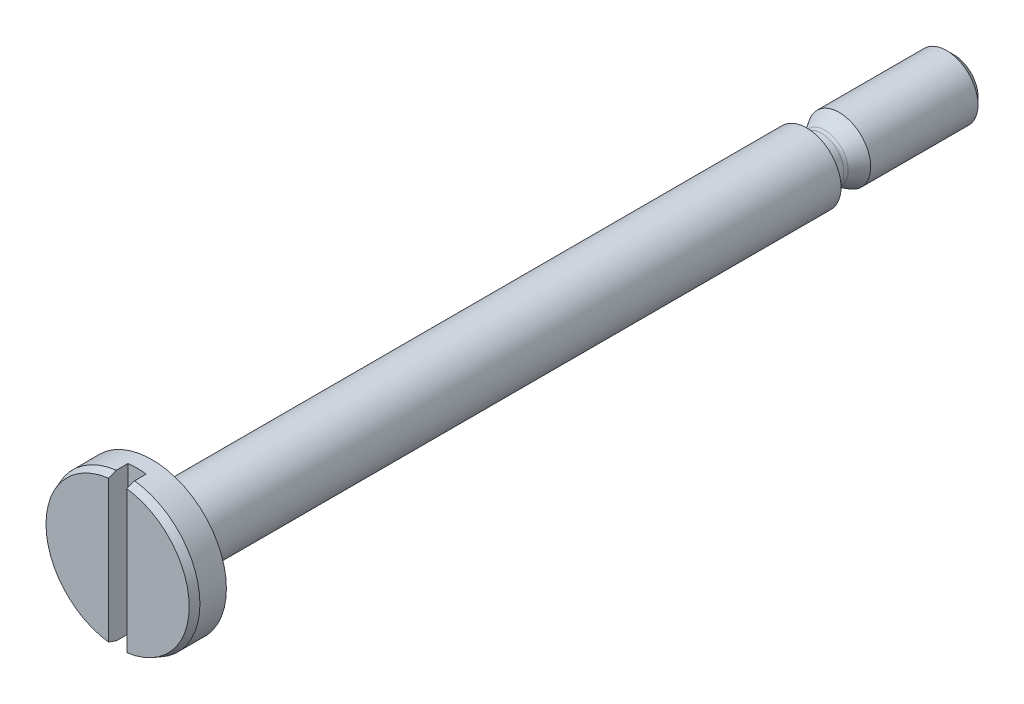
ISO-10303-21;
HEADER;
FILE_DESCRIPTION(('STEP AP214'),'2;1');
FILE_NAME('part.step','',(''),(''),'','','');
FILE_SCHEMA(('AUTOMOTIVE_DESIGN { 1 0 10303 214 1 1 1 1 }'));
ENDSEC;
DATA;
#1=APPLICATION_CONTEXT('core data for automotive mechanical design processes');
#2=APPLICATION_PROTOCOL_DEFINITION('international standard','automotive_design',2000,#1);
#3=PRODUCT_CONTEXT('',#1,'mechanical');
#4=PRODUCT('Part','Part','',(#3));
#5=PRODUCT_RELATED_PRODUCT_CATEGORY('part','',(#4));
#6=PRODUCT_DEFINITION_FORMATION('','',#4);
#7=PRODUCT_DEFINITION_CONTEXT('part definition',#1,'design');
#8=PRODUCT_DEFINITION('design','',#6,#7);
#9=PRODUCT_DEFINITION_SHAPE('','',#8);
#10=(LENGTH_UNIT() NAMED_UNIT(*) SI_UNIT(.MILLI.,.METRE.));
#11=(NAMED_UNIT(*) PLANE_ANGLE_UNIT() SI_UNIT($,.RADIAN.));
#12=(NAMED_UNIT(*) SI_UNIT($,.STERADIAN.) SOLID_ANGLE_UNIT());
#13=UNCERTAINTY_MEASURE_WITH_UNIT(LENGTH_MEASURE(1.E-05),#10,'distance_accuracy_value','');
#14=(GEOMETRIC_REPRESENTATION_CONTEXT(3) GLOBAL_UNCERTAINTY_ASSIGNED_CONTEXT((#13)) GLOBAL_UNIT_ASSIGNED_CONTEXT((#10,
#11,#12)) REPRESENTATION_CONTEXT('',''));
#15=CARTESIAN_POINT('',(0.,0.,0.));
#16=DIRECTION('',(0.,0.,1.));
#17=DIRECTION('',(1.,0.,0.));
#18=AXIS2_PLACEMENT_3D('',#15,#16,#17);
#19=CARTESIAN_POINT('',(0.,0.,3.));
#20=DIRECTION('',(0.,0.,-1.));
#21=DIRECTION('',(1.,0.,0.));
#22=AXIS2_PLACEMENT_3D('',#19,#20,#21);
#23=CONICAL_SURFACE('',#22,6.25,0.349065850398867);
#24=CARTESIAN_POINT('',(0.8,1.282684674784,16.0183331038921));
#25=CARTESIAN_POINT('',(0.8,1.31969750613252,15.9320289441217));
#26=CARTESIAN_POINT('',(0.8,1.35634529756199,15.8455695315623));
#27=CARTESIAN_POINT('',(0.8,1.42903656491699,15.6723985232406));
#28=CARTESIAN_POINT('',(0.8,1.46508005069706,15.5856869316177));
#29=CARTESIAN_POINT('',(0.8,1.57249053020005,15.3252667134921));
#30=CARTESIAN_POINT('',(0.8,1.64314160263818,15.1512631073264));
#31=CARTESIAN_POINT('',(0.8,1.78313581450831,14.8027514850206));
#32=CARTESIAN_POINT('',(0.8,1.85247907608069,14.6282435177574));
#33=CARTESIAN_POINT('',(0.8,1.99022713506688,14.2788544918747));
#34=CARTESIAN_POINT('',(0.8,2.05863191599028,14.1039734267616));
#35=CARTESIAN_POINT('',(0.8,2.26278116137589,13.5790140925357));
#36=CARTESIAN_POINT('',(0.8,2.39749418301222,13.228535117572));
#37=CARTESIAN_POINT('',(0.8,2.66528662696751,12.5269530735152));
#38=CARTESIAN_POINT('',(0.8,2.79836603791585,12.1758500000977));
#39=CARTESIAN_POINT('',(0.8,3.06345205775251,11.4732360697622));
#40=CARTESIAN_POINT('',(0.8,3.19545865793688,11.1217252095622));
#41=CARTESIAN_POINT('',(0.8,3.4587315757989,10.4184262531903));
#42=CARTESIAN_POINT('',(0.8,3.58999789273957,10.0666381567428));
#43=CARTESIAN_POINT('',(0.8,3.98306789976139,9.01083508666003));
#44=CARTESIAN_POINT('',(0.8,4.24408743945695,8.30652828340093));
#45=CARTESIAN_POINT('',(0.8,4.76494842099102,6.89748697210311));
#46=CARTESIAN_POINT('',(0.799999999999999,5.02478987328036,6.19275246792166));
#47=CARTESIAN_POINT('',(0.799999999999999,5.7807909534874,4.13910468669897));
#48=CARTESIAN_POINT('',(0.799999999999999,6.2759886502375,2.78983739057231));
#49=CARTESIAN_POINT('',(0.799999999999999,7.26515091776125,0.0908452356965721));
#50=CARTESIAN_POINT('',(0.799999999999999,7.75911548351327,-1.25887962489049));
#51=CARTESIAN_POINT('',(0.799999999999999,8.74610740807182,-3.95795180399829));
#52=CARTESIAN_POINT('',(0.799999999999999,9.23913509855763,-5.30729900122664));
#53=CARTESIAN_POINT('',(0.799999999999999,10.2247342626746,-8.00615262312761));
#54=CARTESIAN_POINT('',(0.799999999999999,10.7173057385002,-9.35565904699876));
#55=CARTESIAN_POINT('',(0.799999999999999,11.2097754923634,-10.7052024587557));
#56=B_SPLINE_CURVE_WITH_KNOTS('',3,(#24,#25,#26,#27,#28,#29,#30,#31,#32,#33,#34,#35,#36,#37,#38,
#39,#40,#41,#42,#43,#44,#45,#46,#47,#48,#49,#50,#51,#52,#53,#54,#55),.UNSPECIFIED.,.F.,.F.,(4,2,
2,2,2,2,2,2,2,2,2,2,2,2,2,4),(0.,0.281715728622603,0.563426858769586,1.12681803114341,
1.69015632353027,2.25350450189764,3.37992781530171,4.50635896464916,5.63279924387066,
6.75924064429566,9.01259437977368,11.2659280864542,15.5777341615755,19.8895577668937,
24.1993519975173,28.5091253889288),.UNSPECIFIED.);
#57=CARTESIAN_POINT('',(0.799999999999999,6.19858854901662,3.));
#58=VERTEX_POINT('',#57);
#59=CARTESIAN_POINT('',(0.799999999999999,6.45058136914805,2.31313064513635));
#60=VERTEX_POINT('',#59);
#61=EDGE_CURVE('E87',#58,#60,#56,.T.);
#62=ORIENTED_EDGE('',*,*,#61,.F.);
#63=CARTESIAN_POINT('',(0.,0.,3.));
#64=DIRECTION('',(0.,0.,1.));
#65=DIRECTION('',(1.,0.,0.));
#66=AXIS2_PLACEMENT_3D('',#63,#64,#65);
#67=CIRCLE('',#66,6.25);
#68=CARTESIAN_POINT('',(0.800000000000001,-6.19858854901662,3.));
#69=VERTEX_POINT('',#68);
#70=EDGE_CURVE('E136',#69,#58,#67,.T.);
#71=ORIENTED_EDGE('',*,*,#70,.F.);
#72=CARTESIAN_POINT('',(0.800000000000002,-11.2097754923634,-10.7052024587557));
#73=CARTESIAN_POINT('',(0.800000000000002,-10.7313151301791,-9.39404162645047));
#74=CARTESIAN_POINT('',(0.800000000000001,-10.252755273437,-8.08291699403422));
#75=CARTESIAN_POINT('',(0.800000000000001,-9.29521893896152,-5.46083732934418));
#76=CARTESIAN_POINT('',(0.800000000000001,-8.81624246618507,-4.14988229526002));
#77=CARTESIAN_POINT('',(0.800000000000001,-7.85766469950584,-1.52826472851652));
#78=CARTESIAN_POINT('',(0.800000000000001,-7.37806343341921,-0.217602185686537));
#79=CARTESIAN_POINT('',(0.800000000000001,-6.41774553158839,2.40333190126578));
#80=CARTESIAN_POINT('',(0.800000000000001,-5.93702888297808,3.71360344067908));
#81=CARTESIAN_POINT('',(0.800000000000001,-5.28600132063409,5.48332878199399));
#82=CARTESIAN_POINT('',(0.800000000000001,-5.11668814611759,5.94314953330291));
#83=CARTESIAN_POINT('',(0.800000000000001,-4.777673015673,6.86264619155293));
#84=CARTESIAN_POINT('',(0.800000000000001,-4.60797106088742,7.32232209891517));
#85=CARTESIAN_POINT('',(0.800000000000001,-4.26803947406773,8.24146371240554));
#86=CARTESIAN_POINT('',(0.800000000000001,-4.0978098574796,8.70092942424311));
#87=CARTESIAN_POINT('',(0.800000000000001,-3.75658153848174,9.61958053352974));
#88=CARTESIAN_POINT('',(0.800000000000001,-3.58558282833367,10.0787659281053));
#89=CARTESIAN_POINT('',(0.800000000000001,-3.24241966946291,10.9967505844536));
#90=CARTESIAN_POINT('',(0.8,-3.07025511341118,11.4555498061805));
#91=CARTESIAN_POINT('',(0.8,-2.81059604070906,12.1432074796072));
#92=CARTESIAN_POINT('',(0.8,-2.72380899629497,12.3723329720582));
#93=CARTESIAN_POINT('',(0.8,-2.54960336534001,12.8303458563595));
#94=CARTESIAN_POINT('',(0.8,-2.46218477430686,13.0592332465029));
#95=CARTESIAN_POINT('',(0.8,-2.28648055451115,13.5167070062225));
#96=CARTESIAN_POINT('',(0.8,-2.19819482216115,13.7452933360427));
#97=CARTESIAN_POINT('',(0.8,-2.02041957527863,14.2019936853438));
#98=CARTESIAN_POINT('',(0.8,-1.93093008433561,14.4301077139793));
#99=CARTESIAN_POINT('',(0.8,-1.7953388590614,14.7717553953045));
#100=CARTESIAN_POINT('',(0.8,-1.74991301108768,14.8855571516217));
#101=CARTESIAN_POINT('',(0.8,-1.65849116367512,15.1129305739045));
#102=CARTESIAN_POINT('',(0.8,-1.61249516862468,15.2265022416333));
#103=CARTESIAN_POINT('',(0.8,-1.51978061786124,15.4533599132112));
#104=CARTESIAN_POINT('',(0.8,-1.47306201431589,15.5666458975674));
#105=CARTESIAN_POINT('',(0.8,-1.37865883724757,15.7928177882445));
#106=CARTESIAN_POINT('',(0.8,-1.33097423809628,15.9057036838571));
#107=CARTESIAN_POINT('',(0.8,-1.28268467478399,16.0183331038921));
#108=B_SPLINE_CURVE_WITH_KNOTS('',3,(#72,#73,#74,#75,#76,#77,#78,#79,#80,#81,#82,#83,#84,#85,
#86,#87,#88,#89,#90,#91,#92,#93,#94,#95,#96,#97,#98,#99,#100,#101,#102,#103,#104,#105,#106,
#107),.UNSPECIFIED.,.F.,.F.,(4,2,2,2,2,2,2,2,2,2,2,2,2,2,2,2,2,4),(0.,4.18719533725143,
8.37434151750848,12.5613072531194,16.7483215286525,18.2183277493474,19.6883296556524,
21.1582889302119,22.6282630281829,24.0983743449473,24.8334072717516,25.5684454321062,
26.3035724936403,27.0386851701487,27.4062830998455,27.7738782019112,28.1414977415988,
28.5091270472139),.UNSPECIFIED.);
#109=CARTESIAN_POINT('',(0.800000000000001,-6.45058136914805,2.31313064513635));
#110=VERTEX_POINT('',#109);
#111=EDGE_CURVE('E169',#110,#69,#108,.T.);
#112=ORIENTED_EDGE('',*,*,#111,.F.);
#113=CARTESIAN_POINT('',(0.,0.,2.31313064513635));
#114=DIRECTION('',(0.,0.,-1.));
#115=DIRECTION('',(-1.,0.,0.));
#116=AXIS2_PLACEMENT_3D('',#113,#114,#115);
#117=CIRCLE('',#116,6.5);
#118=EDGE_CURVE('E139',#110,#60,#117,.F.);
#119=ORIENTED_EDGE('',*,*,#118,.T.);
#120=EDGE_LOOP('',(#62,#71,#112,#119));
#121=FACE_BOUND('',#120,.T.);
#122=ADVANCED_FACE('F63',(#121),#23,.T.);
#123=CARTESIAN_POINT('',(0.,0.,3.));
#124=DIRECTION('',(0.,0.,1.));
#125=DIRECTION('',(1.,0.,0.));
#126=AXIS2_PLACEMENT_3D('',#123,#124,#125);
#127=PLANE('',#126);
#128=DIRECTION('',(0.,1.,0.));
#129=VECTOR('',#128,1.);
#130=CARTESIAN_POINT('',(0.8,0.,3.));
#131=LINE('',#130,#129);
#132=EDGE_CURVE('E124',#69,#58,#131,.T.);
#133=ORIENTED_EDGE('',*,*,#132,.F.);
#134=ORIENTED_EDGE('',*,*,#70,.T.);
#135=EDGE_LOOP('',(#133,#134));
#136=FACE_BOUND('',#135,.T.);
#137=ADVANCED_FACE('F208',(#136),#127,.T.);
#138=CARTESIAN_POINT('',(0.,0.,3.));
#139=DIRECTION('',(0.,0.,-1.));
#140=DIRECTION('',(-1.,0.,0.));
#141=AXIS2_PLACEMENT_3D('',#138,#139,#140);
#142=CYLINDRICAL_SURFACE('',#141,6.5);
#143=CARTESIAN_POINT('',(0.,0.,1.3));
#144=DIRECTION('',(0.,0.,1.));
#145=DIRECTION('',(1.,0.,0.));
#146=AXIS2_PLACEMENT_3D('',#143,#144,#145);
#147=CIRCLE('',#146,6.5);
#148=CARTESIAN_POINT('',(0.799999999999999,6.45058136914805,1.3));
#149=VERTEX_POINT('',#148);
#150=CARTESIAN_POINT('',(-0.8,6.45058136914805,1.3));
#151=VERTEX_POINT('',#150);
#152=EDGE_CURVE('E13',#149,#151,#147,.T.);
#153=ORIENTED_EDGE('',*,*,#152,.F.);
#154=DIRECTION('',(0.,0.,-1.));
#155=VECTOR('',#154,1.);
#156=CARTESIAN_POINT('',(0.799999999999999,6.45058136914805,3.));
#157=LINE('',#156,#155);
#158=EDGE_CURVE('E142',#149,#60,#157,.F.);
#159=ORIENTED_EDGE('',*,*,#158,.T.);
#160=ORIENTED_EDGE('',*,*,#118,.F.);
#161=DIRECTION('',(0.,0.,-1.));
#162=VECTOR('',#161,1.);
#163=CARTESIAN_POINT('',(0.800000000000001,-6.45058136914805,3.));
#164=LINE('',#163,#162);
#165=CARTESIAN_POINT('',(0.800000000000001,-6.45058136914805,1.3));
#166=VERTEX_POINT('',#165);
#167=EDGE_CURVE('E162',#110,#166,#164,.T.);
#168=ORIENTED_EDGE('',*,*,#167,.T.);
#169=CARTESIAN_POINT('',(-0.799999999999999,-6.45058136914805,1.3));
#170=VERTEX_POINT('',#169);
#171=EDGE_CURVE('E68',#170,#166,#147,.T.);
#172=ORIENTED_EDGE('',*,*,#171,.F.);
#173=DIRECTION('',(0.,0.,-1.));
#174=VECTOR('',#173,1.);
#175=CARTESIAN_POINT('',(-0.799999999999999,-6.45058136914805,3.));
#176=LINE('',#175,#174);
#177=CARTESIAN_POINT('',(-0.799999999999999,-6.45058136914805,2.31313064513635));
#178=VERTEX_POINT('',#177);
#179=EDGE_CURVE('E135',#170,#178,#176,.F.);
#180=ORIENTED_EDGE('',*,*,#179,.T.);
#181=CARTESIAN_POINT('',(-0.800000000000001,6.45058136914805,2.31313064513635));
#182=VERTEX_POINT('',#181);
#183=EDGE_CURVE('E131',#182,#178,#117,.F.);
#184=ORIENTED_EDGE('',*,*,#183,.F.);
#185=DIRECTION('',(0.,0.,-1.));
#186=VECTOR('',#185,1.);
#187=CARTESIAN_POINT('',(-0.800000000000001,6.45058136914805,3.));
#188=LINE('',#187,#186);
#189=EDGE_CURVE('E132',#182,#151,#188,.T.);
#190=ORIENTED_EDGE('',*,*,#189,.T.);
#191=EDGE_LOOP('',(#153,#159,#160,#168,#172,#180,#184,#190));
#192=FACE_BOUND('',#191,.T.);
#193=CARTESIAN_POINT('',(0.,0.,0.));
#194=DIRECTION('',(0.,0.,1.));
#195=DIRECTION('',(1.,0.,0.));
#196=AXIS2_PLACEMENT_3D('',#193,#194,#195);
#197=CIRCLE('',#196,6.5);
#198=CARTESIAN_POINT('',(6.5,0.,0.));
#199=VERTEX_POINT('',#198);
#200=EDGE_CURVE('E150',#199,#199,#197,.T.);
#201=ORIENTED_EDGE('',*,*,#200,.T.);
#202=EDGE_LOOP('',(#201));
#203=FACE_BOUND('',#202,.T.);
#204=ADVANCED_FACE('F70',(#192,#203),#142,.T.);
#205=CARTESIAN_POINT('',(0.,0.,0.));
#206=DIRECTION('',(0.,0.,1.));
#207=DIRECTION('',(1.,0.,0.));
#208=AXIS2_PLACEMENT_3D('',#205,#206,#207);
#209=PLANE('',#208);
#210=CARTESIAN_POINT('',(0.,0.,0.));
#211=DIRECTION('',(0.,0.,-1.));
#212=DIRECTION('',(-1.,0.,0.));
#213=AXIS2_PLACEMENT_3D('',#210,#211,#212);
#214=CIRCLE('',#213,3.);
#215=CARTESIAN_POINT('',(-3.,0.,0.));
#216=VERTEX_POINT('',#215);
#217=EDGE_CURVE('E121',#216,#216,#214,.T.);
#218=ORIENTED_EDGE('',*,*,#217,.F.);
#219=EDGE_LOOP('',(#218));
#220=FACE_BOUND('',#219,.T.);
#221=ORIENTED_EDGE('',*,*,#200,.F.);
#222=EDGE_LOOP('',(#221));
#223=FACE_BOUND('',#222,.T.);
#224=ADVANCED_FACE('F220',(#220,#223),#209,.F.);
#225=CARTESIAN_POINT('',(0.,0.,-70.));
#226=DIRECTION('',(0.,0.,1.));
#227=DIRECTION('',(1.,0.,0.));
#228=AXIS2_PLACEMENT_3D('',#225,#226,#227);
#229=CYLINDRICAL_SURFACE('',#228,3.);
#230=CARTESIAN_POINT('',(0.,0.,-57.1535883014247));
#231=DIRECTION('',(0.,0.,1.));
#232=DIRECTION('',(1.,0.,0.));
#233=AXIS2_PLACEMENT_3D('',#230,#231,#232);
#234=CIRCLE('',#233,3.);
#235=CARTESIAN_POINT('',(3.,0.,-57.1535883014247));
#236=VERTEX_POINT('',#235);
#237=EDGE_CURVE('E248',#236,#236,#234,.T.);
#238=ORIENTED_EDGE('',*,*,#237,.T.);
#239=EDGE_LOOP('',(#238));
#240=FACE_BOUND('',#239,.T.);
#241=ORIENTED_EDGE('',*,*,#217,.T.);
#242=EDGE_LOOP('',(#241));
#243=FACE_BOUND('',#242,.T.);
#244=ADVANCED_FACE('F223',(#240,#243),#229,.T.);
#245=CARTESIAN_POINT('',(-0.8,-1.282684674784,16.0183331038921));
#246=CARTESIAN_POINT('',(-0.8,-1.31969750613252,15.9320289441217));
#247=CARTESIAN_POINT('',(-0.8,-1.35634529756199,15.8455695315623));
#248=CARTESIAN_POINT('',(-0.8,-1.42903656491699,15.6723985232406));
#249=CARTESIAN_POINT('',(-0.8,-1.46508005069706,15.5856869316177));
#250=CARTESIAN_POINT('',(-0.8,-1.57249053020005,15.3252667134921));
#251=CARTESIAN_POINT('',(-0.8,-1.64314160263818,15.1512631073264));
#252=CARTESIAN_POINT('',(-0.8,-1.78313581450831,14.8027514850206));
#253=CARTESIAN_POINT('',(-0.8,-1.85247907608069,14.6282435177574));
#254=CARTESIAN_POINT('',(-0.8,-1.99022713506688,14.2788544918747));
#255=CARTESIAN_POINT('',(-0.8,-2.05863191599028,14.1039734267616));
#256=CARTESIAN_POINT('',(-0.8,-2.26278116137589,13.5790140925357));
#257=CARTESIAN_POINT('',(-0.8,-2.39749418301222,13.228535117572));
#258=CARTESIAN_POINT('',(-0.8,-2.66528662696751,12.5269530735152));
#259=CARTESIAN_POINT('',(-0.8,-2.79836603791585,12.1758500000977));
#260=CARTESIAN_POINT('',(-0.8,-3.06345205775251,11.4732360697622));
#261=CARTESIAN_POINT('',(-0.799999999999999,-3.19545865793688,11.1217252095622));
#262=CARTESIAN_POINT('',(-0.799999999999999,-3.4587315757989,10.4184262531903));
#263=CARTESIAN_POINT('',(-0.799999999999999,-3.58999789273957,10.0666381567428));
#264=CARTESIAN_POINT('',(-0.799999999999999,-3.98306789976139,9.01083508666003));
#265=CARTESIAN_POINT('',(-0.799999999999999,-4.24408743945695,8.30652828340093));
#266=CARTESIAN_POINT('',(-0.799999999999999,-4.76494842099102,6.89748697210311));
#267=CARTESIAN_POINT('',(-0.799999999999999,-5.02478987328036,6.19275246792166));
#268=CARTESIAN_POINT('',(-0.799999999999999,-5.7807909534874,4.13910468669897));
#269=CARTESIAN_POINT('',(-0.799999999999999,-6.27598865023751,2.78983739057231));
#270=CARTESIAN_POINT('',(-0.799999999999999,-7.26515091776125,0.0908452356965764));
#271=CARTESIAN_POINT('',(-0.799999999999999,-7.75911548351327,-1.25887962489048));
#272=CARTESIAN_POINT('',(-0.799999999999999,-8.74610740807181,-3.95795180399829));
#273=CARTESIAN_POINT('',(-0.799999999999999,-9.23913509855763,-5.30729900122664));
#274=CARTESIAN_POINT('',(-0.799999999999999,-10.2247342626746,-8.00615262312761));
#275=CARTESIAN_POINT('',(-0.799999999999998,-10.7173057385002,-9.35565904699876));
#276=CARTESIAN_POINT('',(-0.799999999999998,-11.2097754923634,-10.7052024587557));
#277=B_SPLINE_CURVE_WITH_KNOTS('',3,(#245,#246,#247,#248,#249,#250,#251,#252,#253,#254,#255,
#256,#257,#258,#259,#260,#261,#262,#263,#264,#265,#266,#267,#268,#269,#270,#271,#272,#273,#274,
#275,#276),.UNSPECIFIED.,.F.,.F.,(4,2,2,2,2,2,2,2,2,2,2,2,2,2,2,4),(0.,0.281715728622604,
0.563426858769587,1.12681803114341,1.69015632353027,2.25350450189764,3.37992781530171,
4.50635896464916,5.63279924387066,6.75924064429566,9.01259437977368,11.2659280864541,
15.5777341615755,19.8895577668937,24.1993519975173,28.5091253889288),.UNSPECIFIED.);
#278=CARTESIAN_POINT('',(-0.799999999999999,-6.19858854901662,3.));
#279=VERTEX_POINT('',#278);
#280=EDGE_CURVE('E117',#279,#178,#277,.T.);
#281=ORIENTED_EDGE('',*,*,#280,.F.);
#282=CARTESIAN_POINT('',(-0.800000000000001,6.19858854901662,3.));
#283=VERTEX_POINT('',#282);
#284=EDGE_CURVE('E126',#283,#279,#67,.T.);
#285=ORIENTED_EDGE('',*,*,#284,.F.);
#286=CARTESIAN_POINT('',(-0.800000000000001,11.2097754923634,-10.7052024587557));
#287=CARTESIAN_POINT('',(-0.800000000000001,10.7313151301791,-9.39404162645047));
#288=CARTESIAN_POINT('',(-0.800000000000001,10.252755273437,-8.08291699403422));
#289=CARTESIAN_POINT('',(-0.800000000000001,9.29521893896152,-5.46083732934418));
#290=CARTESIAN_POINT('',(-0.800000000000001,8.81624246618507,-4.14988229526002));
#291=CARTESIAN_POINT('',(-0.800000000000001,7.85766469950584,-1.52826472851652));
#292=CARTESIAN_POINT('',(-0.800000000000001,7.37806343341921,-0.217602185686537));
#293=CARTESIAN_POINT('',(-0.800000000000001,6.4177455315884,2.40333190126578));
#294=CARTESIAN_POINT('',(-0.800000000000001,5.93702888297808,3.71360344067908));
#295=CARTESIAN_POINT('',(-0.800000000000001,5.28600132063409,5.48332878199399));
#296=CARTESIAN_POINT('',(-0.800000000000001,5.11668814611759,5.9431495333029));
#297=CARTESIAN_POINT('',(-0.800000000000001,4.777673015673,6.86264619155292));
#298=CARTESIAN_POINT('',(-0.8,4.60797106088742,7.32232209891517));
#299=CARTESIAN_POINT('',(-0.8,4.26803947406774,8.24146371240553));
#300=CARTESIAN_POINT('',(-0.8,4.09780985747961,8.7009294242431));
#301=CARTESIAN_POINT('',(-0.8,3.75658153848174,9.61958053352973));
#302=CARTESIAN_POINT('',(-0.8,3.58558282833367,10.0787659281053));
#303=CARTESIAN_POINT('',(-0.8,3.24241966946291,10.9967505844536));
#304=CARTESIAN_POINT('',(-0.8,3.07025511341118,11.4555498061805));
#305=CARTESIAN_POINT('',(-0.8,2.81059604070907,12.1432074796072));
#306=CARTESIAN_POINT('',(-0.8,2.72380899629498,12.3723329720582));
#307=CARTESIAN_POINT('',(-0.8,2.54960336534001,12.8303458563595));
#308=CARTESIAN_POINT('',(-0.8,2.46218477430687,13.0592332465029));
#309=CARTESIAN_POINT('',(-0.8,2.28648055451116,13.5167070062225));
#310=CARTESIAN_POINT('',(-0.8,2.19819482216116,13.7452933360427));
#311=CARTESIAN_POINT('',(-0.8,2.02041957527863,14.2019936853438));
#312=CARTESIAN_POINT('',(-0.8,1.93093008433561,14.4301077139793));
#313=CARTESIAN_POINT('',(-0.8,1.7953388590614,14.7717553953045));
#314=CARTESIAN_POINT('',(-0.8,1.74991301108769,14.8855571516217));
#315=CARTESIAN_POINT('',(-0.8,1.65849116367513,15.1129305739045));
#316=CARTESIAN_POINT('',(-0.8,1.61249516862468,15.2265022416333));
#317=CARTESIAN_POINT('',(-0.8,1.51978061786124,15.4533599132112));
#318=CARTESIAN_POINT('',(-0.8,1.4730620143159,15.5666458975674));
#319=CARTESIAN_POINT('',(-0.8,1.37865883724758,15.7928177882445));
#320=CARTESIAN_POINT('',(-0.8,1.33097423809629,15.9057036838571));
#321=CARTESIAN_POINT('',(-0.8,1.282684674784,16.0183331038921));
#322=B_SPLINE_CURVE_WITH_KNOTS('',3,(#286,#287,#288,#289,#290,#291,#292,#293,#294,#295,#296,
#297,#298,#299,#300,#301,#302,#303,#304,#305,#306,#307,#308,#309,#310,#311,#312,#313,#314,#315,
#316,#317,#318,#319,#320,#321),.UNSPECIFIED.,.F.,.F.,(4,2,2,2,2,2,2,2,2,2,2,2,2,2,2,2,2,4),(0.,
4.18719533725143,8.37434151750848,12.5613072531194,16.7483215286525,18.2183277493474,
19.6883296556524,21.1582889302119,22.6282630281829,24.0983743449473,24.8334072717516,
25.5684454321061,26.3035724936403,27.0386851701486,27.4062830998455,27.7738782019112,
28.1414977415987,28.5091270472139),.UNSPECIFIED.);
#323=EDGE_CURVE('E78',#182,#283,#322,.T.);
#324=ORIENTED_EDGE('',*,*,#323,.F.);
#325=ORIENTED_EDGE('',*,*,#183,.T.);
#326=EDGE_LOOP('',(#281,#285,#324,#325));
#327=FACE_BOUND('',#326,.T.);
#328=ADVANCED_FACE('F129',(#327),#23,.T.);
#329=DIRECTION('',(0.,-1.,0.));
#330=VECTOR('',#329,1.);
#331=CARTESIAN_POINT('',(-0.8,0.,3.));
#332=LINE('',#331,#330);
#333=EDGE_CURVE('E112',#283,#279,#332,.T.);
#334=ORIENTED_EDGE('',*,*,#333,.F.);
#335=ORIENTED_EDGE('',*,*,#284,.T.);
#336=EDGE_LOOP('',(#334,#335));
#337=FACE_BOUND('',#336,.T.);
#338=ADVANCED_FACE('F134',(#337),#127,.T.);
#339=CARTESIAN_POINT('',(0.,0.,1.3));
#340=DIRECTION('',(0.,0.,1.));
#341=DIRECTION('',(1.,0.,0.));
#342=AXIS2_PLACEMENT_3D('',#339,#340,#341);
#343=PLANE('',#342);
#344=ORIENTED_EDGE('',*,*,#152,.T.);
#345=DIRECTION('',(0.,-1.,0.));
#346=VECTOR('',#345,1.);
#347=CARTESIAN_POINT('',(-0.800000000000001,7.04674646944684,1.3));
#348=LINE('',#347,#346);
#349=EDGE_CURVE('E159',#151,#170,#348,.T.);
#350=ORIENTED_EDGE('',*,*,#349,.T.);
#351=ORIENTED_EDGE('',*,*,#171,.T.);
#352=DIRECTION('',(0.,1.,0.));
#353=VECTOR('',#352,1.);
#354=CARTESIAN_POINT('',(0.799999999999999,7.04674646944684,1.3));
#355=LINE('',#354,#353);
#356=EDGE_CURVE('E156',#166,#149,#355,.T.);
#357=ORIENTED_EDGE('',*,*,#356,.T.);
#358=EDGE_LOOP('',(#344,#350,#351,#357));
#359=FACE_BOUND('',#358,.T.);
#360=ADVANCED_FACE('F154',(#359),#343,.T.);
#361=CARTESIAN_POINT('',(0.799999999999999,7.04674646944684,1.3));
#362=DIRECTION('',(1.,0.,0.));
#363=DIRECTION('',(0.,1.,0.));
#364=AXIS2_PLACEMENT_3D('',#361,#362,#363);
#365=PLANE('',#364);
#366=ORIENTED_EDGE('',*,*,#356,.F.);
#367=ORIENTED_EDGE('',*,*,#167,.F.);
#368=ORIENTED_EDGE('',*,*,#111,.T.);
#369=ORIENTED_EDGE('',*,*,#132,.T.);
#370=ORIENTED_EDGE('',*,*,#61,.T.);
#371=ORIENTED_EDGE('',*,*,#158,.F.);
#372=EDGE_LOOP('',(#366,#367,#368,#369,#370,#371));
#373=FACE_BOUND('',#372,.T.);
#374=ADVANCED_FACE('F163',(#373),#365,.F.);
#375=CARTESIAN_POINT('',(-0.800000000000001,7.04674646944684,1.3));
#376=DIRECTION('',(-1.,0.,0.));
#377=DIRECTION('',(0.,-1.,0.));
#378=AXIS2_PLACEMENT_3D('',#375,#376,#377);
#379=PLANE('',#378);
#380=ORIENTED_EDGE('',*,*,#349,.F.);
#381=ORIENTED_EDGE('',*,*,#189,.F.);
#382=ORIENTED_EDGE('',*,*,#323,.T.);
#383=ORIENTED_EDGE('',*,*,#333,.T.);
#384=ORIENTED_EDGE('',*,*,#280,.T.);
#385=ORIENTED_EDGE('',*,*,#179,.F.);
#386=EDGE_LOOP('',(#380,#381,#382,#383,#384,#385));
#387=FACE_BOUND('',#386,.T.);
#388=ADVANCED_FACE('F120',(#387),#379,.F.);
#389=CARTESIAN_POINT('',(0.,0.,-70.));
#390=DIRECTION('',(0.,0.,1.));
#391=DIRECTION('',(1.,0.,0.));
#392=AXIS2_PLACEMENT_3D('',#389,#390,#391);
#393=CYLINDRICAL_SURFACE('',#392,2.7432);
#394=CARTESIAN_POINT('',(0.,0.,-60.));
#395=DIRECTION('',(0.,0.,1.));
#396=DIRECTION('',(1.,0.,0.));
#397=AXIS2_PLACEMENT_3D('',#394,#395,#396);
#398=CIRCLE('',#397,2.7432);
#399=CARTESIAN_POINT('',(2.7432,0.,-60.));
#400=VERTEX_POINT('',#399);
#401=EDGE_CURVE('E165',#400,#400,#398,.T.);
#402=ORIENTED_EDGE('',*,*,#401,.F.);
#403=EDGE_LOOP('',(#402));
#404=FACE_BOUND('',#403,.T.);
#405=CARTESIAN_POINT('',(0.,0.,-69.37008));
#406=DIRECTION('',(0.,0.,1.));
#407=DIRECTION('',(1.,0.,0.));
#408=AXIS2_PLACEMENT_3D('',#405,#406,#407);
#409=CIRCLE('',#408,2.7432);
#410=CARTESIAN_POINT('',(2.7432,0.,-69.37008));
#411=VERTEX_POINT('',#410);
#412=EDGE_CURVE('E249',#411,#411,#409,.T.);
#413=ORIENTED_EDGE('',*,*,#412,.T.);
#414=EDGE_LOOP('',(#413));
#415=FACE_BOUND('',#414,.T.);
#416=ADVANCED_FACE('F195',(#404,#415),#393,.T.);
#417=CARTESIAN_POINT('',(0.,0.,-60.));
#418=DIRECTION('',(0.,0.,-1.));
#419=DIRECTION('',(-1.,0.,0.));
#420=AXIS2_PLACEMENT_3D('',#417,#418,#419);
#421=CONICAL_SURFACE('',#420,2.7432,0.523598775598274);
#422=CARTESIAN_POINT('',(0.,0.,-58.7535891654247));
#423=DIRECTION('',(0.,0.,1.));
#424=DIRECTION('',(1.,0.,0.));
#425=AXIS2_PLACEMENT_3D('',#422,#423,#424);
#426=CIRCLE('',#425,2.0235843691371);
#427=CARTESIAN_POINT('',(2.0235843691371,0.,-58.7535891654247));
#428=VERTEX_POINT('',#427);
#429=EDGE_CURVE('E264',#428,#428,#426,.T.);
#430=ORIENTED_EDGE('',*,*,#429,.F.);
#431=EDGE_LOOP('',(#430));
#432=FACE_BOUND('',#431,.T.);
#433=ORIENTED_EDGE('',*,*,#401,.T.);
#434=EDGE_LOOP('',(#433));
#435=FACE_BOUND('',#434,.T.);
#436=ADVANCED_FACE('F272',(#432,#435),#421,.T.);
#437=CARTESIAN_POINT('',(0.,0.,-58.4535890034247));
#438=DIRECTION('',(0.,0.,1.));
#439=DIRECTION('',(1.,0.,0.));
#440=AXIS2_PLACEMENT_3D('',#437,#438,#439);
#441=TOROIDAL_SURFACE('',#440,2.543199892,0.600000323999999);
#442=CARTESIAN_POINT('',(0.,0.,-58.4535890034247));
#443=DIRECTION('',(0.,0.,1.));
#444=DIRECTION('',(1.,0.,0.));
#445=AXIS2_PLACEMENT_3D('',#442,#443,#444);
#446=CIRCLE('',#445,1.943199568);
#447=CARTESIAN_POINT('',(1.943199568,0.,-58.4535890034247));
#448=VERTEX_POINT('',#447);
#449=EDGE_CURVE('E265',#448,#448,#446,.T.);
#450=ORIENTED_EDGE('',*,*,#449,.F.);
#451=EDGE_LOOP('',(#450));
#452=FACE_BOUND('',#451,.T.);
#453=ORIENTED_EDGE('',*,*,#429,.T.);
#454=EDGE_LOOP('',(#453));
#455=FACE_BOUND('',#454,.T.);
#456=ADVANCED_FACE('F276',(#452,#455),#441,.F.);
#457=CARTESIAN_POINT('',(0.,0.,-70.));
#458=DIRECTION('',(0.,0.,1.));
#459=DIRECTION('',(1.,0.,0.));
#460=AXIS2_PLACEMENT_3D('',#457,#458,#459);
#461=CYLINDRICAL_SURFACE('',#460,1.943199568);
#462=CARTESIAN_POINT('',(0.,0.,-57.7535886254247));
#463=DIRECTION('',(0.,0.,1.));
#464=DIRECTION('',(1.,0.,0.));
#465=AXIS2_PLACEMENT_3D('',#462,#463,#464);
#466=CIRCLE('',#465,1.943199568);
#467=CARTESIAN_POINT('',(1.943199568,0.,-57.7535886254247));
#468=VERTEX_POINT('',#467);
#469=EDGE_CURVE('E256',#468,#468,#466,.T.);
#470=ORIENTED_EDGE('',*,*,#469,.F.);
#471=EDGE_LOOP('',(#470));
#472=FACE_BOUND('',#471,.T.);
#473=ORIENTED_EDGE('',*,*,#449,.T.);
#474=EDGE_LOOP('',(#473));
#475=FACE_BOUND('',#474,.T.);
#476=ADVANCED_FACE('F284',(#472,#475),#461,.T.);
#477=CARTESIAN_POINT('',(0.,0.,-57.7535886254247));
#478=DIRECTION('',(0.,0.,1.));
#479=DIRECTION('',(1.,0.,0.));
#480=AXIS2_PLACEMENT_3D('',#477,#478,#479);
#481=TOROIDAL_SURFACE('',#480,2.543199892,0.600000323999999);
#482=CARTESIAN_POINT('',(0.,0.,-57.1535883014247));
#483=DIRECTION('',(0.,0.,1.));
#484=DIRECTION('',(1.,0.,0.));
#485=AXIS2_PLACEMENT_3D('',#482,#483,#484);
#486=CIRCLE('',#485,2.543199892);
#487=CARTESIAN_POINT('',(2.543199892,0.,-57.1535883014247));
#488=VERTEX_POINT('',#487);
#489=EDGE_CURVE('E255',#488,#488,#486,.T.);
#490=ORIENTED_EDGE('',*,*,#489,.F.);
#491=EDGE_LOOP('',(#490));
#492=FACE_BOUND('',#491,.T.);
#493=ORIENTED_EDGE('',*,*,#469,.T.);
#494=EDGE_LOOP('',(#493));
#495=FACE_BOUND('',#494,.T.);
#496=ADVANCED_FACE('F288',(#492,#495),#481,.F.);
#497=CARTESIAN_POINT('',(2.543199892,0.,-57.1535883014247));
#498=DIRECTION('',(0.,0.,1.));
#499=DIRECTION('',(1.,0.,0.));
#500=AXIS2_PLACEMENT_3D('',#497,#498,#499);
#501=PLANE('',#500);
#502=ORIENTED_EDGE('',*,*,#237,.F.);
#503=EDGE_LOOP('',(#502));
#504=FACE_BOUND('',#503,.T.);
#505=ORIENTED_EDGE('',*,*,#489,.T.);
#506=EDGE_LOOP('',(#505));
#507=FACE_BOUND('',#506,.T.);
#508=ADVANCED_FACE('F245',(#504,#507),#501,.F.);
#509=CARTESIAN_POINT('',(0.,0.,-70.));
#510=DIRECTION('',(0.,0.,1.));
#511=DIRECTION('',(1.,0.,0.));
#512=AXIS2_PLACEMENT_3D('',#509,#510,#511);
#513=CONICAL_SURFACE('',#512,2.11328,0.785398163397455);
#514=ORIENTED_EDGE('',*,*,#412,.F.);
#515=EDGE_LOOP('',(#514));
#516=FACE_BOUND('',#515,.T.);
#517=CARTESIAN_POINT('',(0.,0.,-70.));
#518=DIRECTION('',(0.,0.,1.));
#519=DIRECTION('',(1.,0.,0.));
#520=AXIS2_PLACEMENT_3D('',#517,#518,#519);
#521=CIRCLE('',#520,2.11328);
#522=CARTESIAN_POINT('',(2.11328,0.,-70.));
#523=VERTEX_POINT('',#522);
#524=EDGE_CURVE('E250',#523,#523,#521,.T.);
#525=ORIENTED_EDGE('',*,*,#524,.T.);
#526=EDGE_LOOP('',(#525));
#527=FACE_BOUND('',#526,.T.);
#528=ADVANCED_FACE('F240',(#516,#527),#513,.T.);
#529=CARTESIAN_POINT('',(0.,0.,-70.));
#530=DIRECTION('',(0.,0.,-1.));
#531=DIRECTION('',(-1.,0.,0.));
#532=AXIS2_PLACEMENT_3D('',#529,#530,#531);
#533=PLANE('',#532);
#534=ORIENTED_EDGE('',*,*,#524,.F.);
#535=EDGE_LOOP('',(#534));
#536=FACE_BOUND('',#535,.T.);
#537=ADVANCED_FACE('F236',(#536),#533,.T.);
#538=CLOSED_SHELL('',(#122,#137,#204,#224,#244,#328,#338,#360,#374,#388,#416,#436,#456,#476,
#496,#508,#528,#537));
#539=MANIFOLD_SOLID_BREP('B2',#538);
#540=ADVANCED_BREP_SHAPE_REPRESENTATION('',(#18,#539),#14);
#541=SHAPE_DEFINITION_REPRESENTATION(#9,#540);
ENDSEC;
END-ISO-10303-21;
